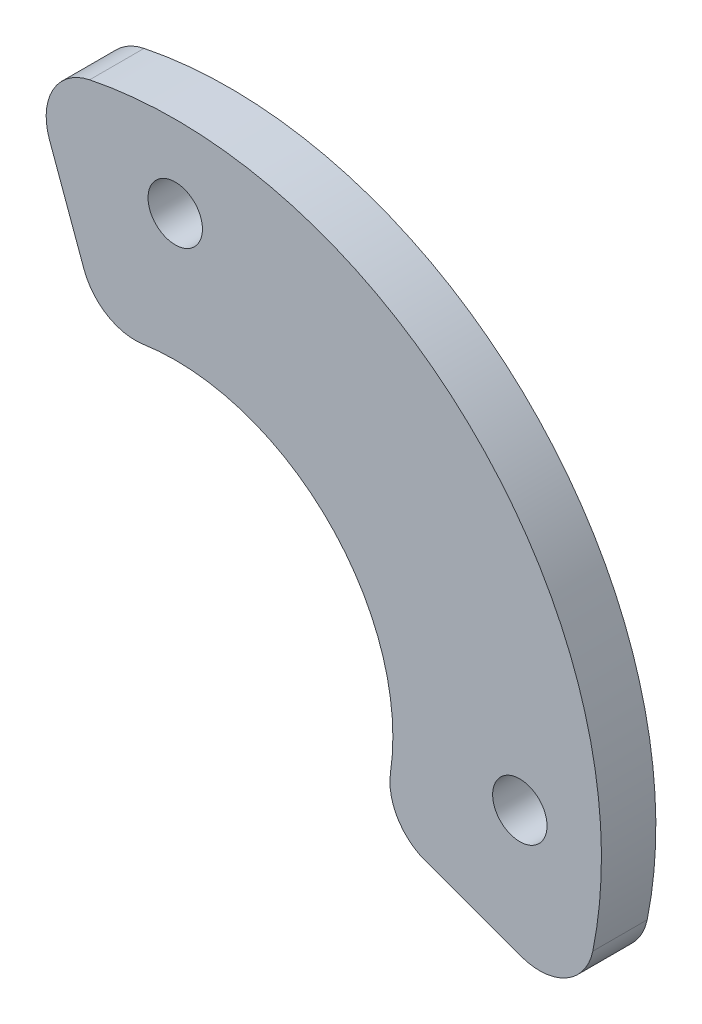
ISO-10303-21;
HEADER;
FILE_DESCRIPTION(('STEP AP214'),'2;1');
FILE_NAME('part.step','',(''),(''),'','','');
FILE_SCHEMA(('AUTOMOTIVE_DESIGN { 1 0 10303 214 1 1 1 1 }'));
ENDSEC;
DATA;
#1=APPLICATION_CONTEXT('core data for automotive mechanical design processes');
#2=APPLICATION_PROTOCOL_DEFINITION('international standard','automotive_design',2000,#1);
#3=PRODUCT_CONTEXT('',#1,'mechanical');
#4=PRODUCT('Part','Part','',(#3));
#5=PRODUCT_RELATED_PRODUCT_CATEGORY('part','',(#4));
#6=PRODUCT_DEFINITION_FORMATION('','',#4);
#7=PRODUCT_DEFINITION_CONTEXT('part definition',#1,'design');
#8=PRODUCT_DEFINITION('design','',#6,#7);
#9=PRODUCT_DEFINITION_SHAPE('','',#8);
#10=(LENGTH_UNIT() NAMED_UNIT(*) SI_UNIT(.MILLI.,.METRE.));
#11=(NAMED_UNIT(*) PLANE_ANGLE_UNIT() SI_UNIT($,.RADIAN.));
#12=(NAMED_UNIT(*) SI_UNIT($,.STERADIAN.) SOLID_ANGLE_UNIT());
#13=UNCERTAINTY_MEASURE_WITH_UNIT(LENGTH_MEASURE(1.E-05),#10,'distance_accuracy_value','');
#14=(GEOMETRIC_REPRESENTATION_CONTEXT(3) GLOBAL_UNCERTAINTY_ASSIGNED_CONTEXT((#13)) GLOBAL_UNIT_ASSIGNED_CONTEXT((#10,
#11,#12)) REPRESENTATION_CONTEXT('',''));
#15=CARTESIAN_POINT('',(0.,0.,0.));
#16=DIRECTION('',(0.,0.,1.));
#17=DIRECTION('',(1.,0.,0.));
#18=AXIS2_PLACEMENT_3D('',#15,#16,#17);
#19=CARTESIAN_POINT('',(0.,0.,3.));
#20=DIRECTION('',(0.342020143325663,0.939692620785911,0.));
#21=DIRECTION('',(-0.939692620785911,0.342020143325663,0.));
#22=AXIS2_PLACEMENT_3D('',#19,#20,#21);
#23=PLANE('',#22);
#24=DIRECTION('',(0.939692620785911,-0.342020143325663,0.));
#25=VECTOR('',#24,1.);
#26=CARTESIAN_POINT('',(0.,0.,0.));
#27=LINE('',#26,#25);
#28=CARTESIAN_POINT('',(13.8106046159048,-5.02664899740866,0.));
#29=VERTEX_POINT('',#28);
#30=CARTESIAN_POINT('',(19.0563083680009,-6.93592902095015,0.));
#31=VERTEX_POINT('',#30);
#32=EDGE_CURVE('E138',#29,#31,#27,.T.);
#33=ORIENTED_EDGE('',*,*,#32,.T.);
#34=DIRECTION('',(0.,0.,-1.));
#35=VECTOR('',#34,1.);
#36=CARTESIAN_POINT('',(19.0563083680009,-6.93592902095015,3.));
#37=LINE('',#36,#35);
#38=CARTESIAN_POINT('',(19.0563083680009,-6.93592902095015,3.));
#39=VERTEX_POINT('',#38);
#40=EDGE_CURVE('E115',#31,#39,#37,.F.);
#41=ORIENTED_EDGE('',*,*,#40,.T.);
#42=DIRECTION('',(0.939692620785911,-0.342020143325663,0.));
#43=VECTOR('',#42,1.);
#44=CARTESIAN_POINT('',(0.,0.,3.));
#45=LINE('',#44,#43);
#46=CARTESIAN_POINT('',(13.8106046159048,-5.02664899740866,3.));
#47=VERTEX_POINT('',#46);
#48=EDGE_CURVE('E187',#47,#39,#45,.T.);
#49=ORIENTED_EDGE('',*,*,#48,.F.);
#50=DIRECTION('',(0.,0.,1.));
#51=VECTOR('',#50,1.);
#52=CARTESIAN_POINT('',(13.8106046159048,-5.02664899740866,0.));
#53=LINE('',#52,#51);
#54=EDGE_CURVE('E120',#47,#29,#53,.F.);
#55=ORIENTED_EDGE('',*,*,#54,.T.);
#56=EDGE_LOOP('',(#33,#41,#49,#55));
#57=FACE_BOUND('',#56,.T.);
#58=ADVANCED_FACE('F43',(#57),#23,.F.);
#59=CARTESIAN_POINT('',(0.,0.,3.));
#60=DIRECTION('',(0.,0.,-1.));
#61=DIRECTION('',(-1.,0.,0.));
#62=AXIS2_PLACEMENT_3D('',#59,#60,#61);
#63=CYLINDRICAL_SURFACE('',#62,23.5);
#64=CARTESIAN_POINT('',(0.,0.,3.));
#65=DIRECTION('',(0.,0.,1.));
#66=DIRECTION('',(1.,0.,0.));
#67=AXIS2_PLACEMENT_3D('',#64,#65,#66);
#68=CIRCLE('',#67,23.5);
#69=CARTESIAN_POINT('',(23.0212520367064,-4.71931718180106,3.));
#70=VERTEX_POINT('',#69);
#71=CARTESIAN_POINT('',(-4.71931718180107,23.0212520367064,3.));
#72=VERTEX_POINT('',#71);
#73=EDGE_CURVE('E130',#70,#72,#68,.T.);
#74=ORIENTED_EDGE('',*,*,#73,.F.);
#75=DIRECTION('',(0.,0.,-1.));
#76=VECTOR('',#75,1.);
#77=CARTESIAN_POINT('',(23.0212520367064,-4.71931718180107,3.));
#78=LINE('',#77,#76);
#79=CARTESIAN_POINT('',(23.0212520367064,-4.71931718180106,0.));
#80=VERTEX_POINT('',#79);
#81=EDGE_CURVE('E114',#70,#80,#78,.T.);
#82=ORIENTED_EDGE('',*,*,#81,.T.);
#83=CARTESIAN_POINT('',(0.,0.,0.));
#84=DIRECTION('',(0.,0.,1.));
#85=DIRECTION('',(1.,0.,0.));
#86=AXIS2_PLACEMENT_3D('',#83,#84,#85);
#87=CIRCLE('',#86,23.5);
#88=CARTESIAN_POINT('',(-4.71931718180107,23.0212520367064,0.));
#89=VERTEX_POINT('',#88);
#90=EDGE_CURVE('E127',#80,#89,#87,.T.);
#91=ORIENTED_EDGE('',*,*,#90,.T.);
#92=DIRECTION('',(0.,0.,-1.));
#93=VECTOR('',#92,1.);
#94=CARTESIAN_POINT('',(-4.71931718180107,23.0212520367064,3.));
#95=LINE('',#94,#93);
#96=EDGE_CURVE('E132',#89,#72,#95,.F.);
#97=ORIENTED_EDGE('',*,*,#96,.T.);
#98=EDGE_LOOP('',(#74,#82,#91,#97));
#99=FACE_BOUND('',#98,.T.);
#100=ADVANCED_FACE('F126',(#99),#63,.T.);
#101=CARTESIAN_POINT('',(0.,0.,3.));
#102=DIRECTION('',(-0.93969262078591,-0.342020143325663,0.));
#103=DIRECTION('',(0.342020143325663,-0.93969262078591,0.));
#104=AXIS2_PLACEMENT_3D('',#101,#102,#103);
#105=PLANE('',#104);
#106=DIRECTION('',(-0.342020143325663,0.939692620785911,0.));
#107=VECTOR('',#106,1.);
#108=CARTESIAN_POINT('',(0.,0.,3.));
#109=LINE('',#108,#107);
#110=CARTESIAN_POINT('',(-5.02664899740867,13.8106046159048,3.));
#111=VERTEX_POINT('',#110);
#112=CARTESIAN_POINT('',(-6.93592902095016,19.0563083680009,3.));
#113=VERTEX_POINT('',#112);
#114=EDGE_CURVE('E172',#111,#113,#109,.T.);
#115=ORIENTED_EDGE('',*,*,#114,.T.);
#116=DIRECTION('',(0.,0.,1.));
#117=VECTOR('',#116,1.);
#118=CARTESIAN_POINT('',(-6.93592902095016,19.0563083680009,0.));
#119=LINE('',#118,#117);
#120=CARTESIAN_POINT('',(-6.93592902095016,19.0563083680009,0.));
#121=VERTEX_POINT('',#120);
#122=EDGE_CURVE('E11',#113,#121,#119,.F.);
#123=ORIENTED_EDGE('',*,*,#122,.T.);
#124=DIRECTION('',(-0.342020143325663,0.939692620785911,0.));
#125=VECTOR('',#124,1.);
#126=CARTESIAN_POINT('',(0.,0.,0.));
#127=LINE('',#126,#125);
#128=CARTESIAN_POINT('',(-5.02664899740867,13.8106046159048,0.));
#129=VERTEX_POINT('',#128);
#130=EDGE_CURVE('E137',#129,#121,#127,.T.);
#131=ORIENTED_EDGE('',*,*,#130,.F.);
#132=DIRECTION('',(0.,0.,-1.));
#133=VECTOR('',#132,1.);
#134=CARTESIAN_POINT('',(-5.02664899740867,13.8106046159048,3.));
#135=LINE('',#134,#133);
#136=EDGE_CURVE('E51',#129,#111,#135,.F.);
#137=ORIENTED_EDGE('',*,*,#136,.T.);
#138=EDGE_LOOP('',(#115,#123,#131,#137));
#139=FACE_BOUND('',#138,.T.);
#140=ADVANCED_FACE('F171',(#139),#105,.T.);
#141=CARTESIAN_POINT('',(19.,0.,3.));
#142=DIRECTION('',(0.,0.,-1.));
#143=DIRECTION('',(-1.,0.,0.));
#144=AXIS2_PLACEMENT_3D('',#141,#142,#143);
#145=CYLINDRICAL_SURFACE('',#144,1.5);
#146=CARTESIAN_POINT('',(19.,0.,3.));
#147=DIRECTION('',(0.,0.,1.));
#148=DIRECTION('',(1.,0.,0.));
#149=AXIS2_PLACEMENT_3D('',#146,#147,#148);
#150=CIRCLE('',#149,1.5);
#151=CARTESIAN_POINT('',(20.5,0.,3.));
#152=VERTEX_POINT('',#151);
#153=EDGE_CURVE('E188',#152,#152,#150,.T.);
#154=ORIENTED_EDGE('',*,*,#153,.T.);
#155=EDGE_LOOP('',(#154));
#156=FACE_BOUND('',#155,.T.);
#157=CARTESIAN_POINT('',(19.,0.,0.));
#158=DIRECTION('',(0.,0.,1.));
#159=DIRECTION('',(1.,0.,0.));
#160=AXIS2_PLACEMENT_3D('',#157,#158,#159);
#161=CIRCLE('',#160,1.5);
#162=CARTESIAN_POINT('',(20.5,0.,0.));
#163=VERTEX_POINT('',#162);
#164=EDGE_CURVE('E142',#163,#163,#161,.T.);
#165=ORIENTED_EDGE('',*,*,#164,.F.);
#166=EDGE_LOOP('',(#165));
#167=FACE_BOUND('',#166,.T.);
#168=ADVANCED_FACE('F202',(#156,#167),#145,.F.);
#169=CARTESIAN_POINT('',(0.,19.,3.));
#170=DIRECTION('',(0.,0.,-1.));
#171=DIRECTION('',(-1.,0.,0.));
#172=AXIS2_PLACEMENT_3D('',#169,#170,#171);
#173=CYLINDRICAL_SURFACE('',#172,1.5);
#174=CARTESIAN_POINT('',(0.,19.,3.));
#175=DIRECTION('',(0.,0.,1.));
#176=DIRECTION('',(1.,0.,0.));
#177=AXIS2_PLACEMENT_3D('',#174,#175,#176);
#178=CIRCLE('',#177,1.5);
#179=CARTESIAN_POINT('',(1.5,19.,3.));
#180=VERTEX_POINT('',#179);
#181=EDGE_CURVE('E148',#180,#180,#178,.T.);
#182=ORIENTED_EDGE('',*,*,#181,.T.);
#183=EDGE_LOOP('',(#182));
#184=FACE_BOUND('',#183,.T.);
#185=CARTESIAN_POINT('',(0.,19.,0.));
#186=DIRECTION('',(0.,0.,1.));
#187=DIRECTION('',(1.,0.,0.));
#188=AXIS2_PLACEMENT_3D('',#185,#186,#187);
#189=CIRCLE('',#188,1.5);
#190=CARTESIAN_POINT('',(1.5,19.,0.));
#191=VERTEX_POINT('',#190);
#192=EDGE_CURVE('E196',#191,#191,#189,.T.);
#193=ORIENTED_EDGE('',*,*,#192,.F.);
#194=EDGE_LOOP('',(#193));
#195=FACE_BOUND('',#194,.T.);
#196=ADVANCED_FACE('F204',(#184,#195),#173,.F.);
#197=CARTESIAN_POINT('',(0.,0.,3.));
#198=DIRECTION('',(0.,0.,-1.));
#199=DIRECTION('',(-1.,0.,0.));
#200=AXIS2_PLACEMENT_3D('',#197,#198,#199);
#201=CYLINDRICAL_SURFACE('',#200,12.);
#202=CARTESIAN_POINT('',(0.,0.,0.));
#203=DIRECTION('',(0.,0.,1.));
#204=DIRECTION('',(1.,0.,0.));
#205=AXIS2_PLACEMENT_3D('',#202,#203,#204);
#206=CIRCLE('',#205,12.);
#207=CARTESIAN_POINT('',(11.8693320367054,-1.76605690804074,0.));
#208=VERTEX_POINT('',#207);
#209=CARTESIAN_POINT('',(-1.76605690804075,11.8693320367054,0.));
#210=VERTEX_POINT('',#209);
#211=EDGE_CURVE('E140',#208,#210,#206,.T.);
#212=ORIENTED_EDGE('',*,*,#211,.F.);
#213=DIRECTION('',(0.,0.,-1.));
#214=VECTOR('',#213,1.);
#215=CARTESIAN_POINT('',(11.8693320367054,-1.76605690804074,3.));
#216=LINE('',#215,#214);
#217=CARTESIAN_POINT('',(11.8693320367054,-1.76605690804074,3.));
#218=VERTEX_POINT('',#217);
#219=EDGE_CURVE('E65',#208,#218,#216,.F.);
#220=ORIENTED_EDGE('',*,*,#219,.T.);
#221=CARTESIAN_POINT('',(0.,0.,3.));
#222=DIRECTION('',(0.,0.,1.));
#223=DIRECTION('',(1.,0.,0.));
#224=AXIS2_PLACEMENT_3D('',#221,#222,#223);
#225=CIRCLE('',#224,12.);
#226=CARTESIAN_POINT('',(-1.76605690804075,11.8693320367054,3.));
#227=VERTEX_POINT('',#226);
#228=EDGE_CURVE('E149',#218,#227,#225,.T.);
#229=ORIENTED_EDGE('',*,*,#228,.T.);
#230=DIRECTION('',(0.,0.,-1.));
#231=VECTOR('',#230,1.);
#232=CARTESIAN_POINT('',(-1.76605690804075,11.8693320367054,3.));
#233=LINE('',#232,#231);
#234=EDGE_CURVE('E164',#227,#210,#233,.T.);
#235=ORIENTED_EDGE('',*,*,#234,.T.);
#236=EDGE_LOOP('',(#212,#220,#229,#235));
#237=FACE_BOUND('',#236,.T.);
#238=ADVANCED_FACE('F180',(#237),#201,.F.);
#239=CARTESIAN_POINT('',(0.,0.,3.));
#240=DIRECTION('',(0.,0.,1.));
#241=DIRECTION('',(1.,0.,0.));
#242=AXIS2_PLACEMENT_3D('',#239,#240,#241);
#243=PLANE('',#242);
#244=ORIENTED_EDGE('',*,*,#181,.F.);
#245=EDGE_LOOP('',(#244));
#246=FACE_BOUND('',#245,.T.);
#247=ORIENTED_EDGE('',*,*,#153,.F.);
#248=EDGE_LOOP('',(#247));
#249=FACE_BOUND('',#248,.T.);
#250=ORIENTED_EDGE('',*,*,#48,.T.);
#251=CARTESIAN_POINT('',(20.0823687979779,-4.11685115859242,3.));
#252=DIRECTION('',(0.,0.,1.));
#253=DIRECTION('',(1.,0.,0.));
#254=AXIS2_PLACEMENT_3D('',#251,#252,#253);
#255=CIRCLE('',#254,3.);
#256=EDGE_CURVE('E162',#39,#70,#255,.T.);
#257=ORIENTED_EDGE('',*,*,#256,.T.);
#258=ORIENTED_EDGE('',*,*,#73,.T.);
#259=CARTESIAN_POINT('',(-4.11685115859243,20.0823687979779,3.));
#260=DIRECTION('',(0.,0.,1.));
#261=DIRECTION('',(1.,0.,0.));
#262=AXIS2_PLACEMENT_3D('',#259,#260,#261);
#263=CIRCLE('',#262,3.);
#264=EDGE_CURVE('E158',#72,#113,#263,.T.);
#265=ORIENTED_EDGE('',*,*,#264,.T.);
#266=ORIENTED_EDGE('',*,*,#114,.F.);
#267=CARTESIAN_POINT('',(-2.20757113505094,14.8366650458818,3.));
#268=DIRECTION('',(0.,0.,1.));
#269=DIRECTION('',(1.,0.,0.));
#270=AXIS2_PLACEMENT_3D('',#267,#268,#269);
#271=CIRCLE('',#270,3.);
#272=EDGE_CURVE('E58',#111,#227,#271,.T.);
#273=ORIENTED_EDGE('',*,*,#272,.T.);
#274=ORIENTED_EDGE('',*,*,#228,.F.);
#275=CARTESIAN_POINT('',(14.8366650458818,-2.20757113505093,3.));
#276=DIRECTION('',(0.,0.,1.));
#277=DIRECTION('',(1.,0.,0.));
#278=AXIS2_PLACEMENT_3D('',#275,#276,#277);
#279=CIRCLE('',#278,3.);
#280=EDGE_CURVE('E160',#218,#47,#279,.T.);
#281=ORIENTED_EDGE('',*,*,#280,.T.);
#282=EDGE_LOOP('',(#250,#257,#258,#265,#266,#273,#274,#281));
#283=FACE_BOUND('',#282,.T.);
#284=ADVANCED_FACE('F176',(#246,#249,#283),#243,.T.);
#285=CARTESIAN_POINT('',(0.,0.,0.));
#286=DIRECTION('',(0.,0.,1.));
#287=DIRECTION('',(1.,0.,0.));
#288=AXIS2_PLACEMENT_3D('',#285,#286,#287);
#289=PLANE('',#288);
#290=ORIENTED_EDGE('',*,*,#192,.T.);
#291=EDGE_LOOP('',(#290));
#292=FACE_BOUND('',#291,.T.);
#293=ORIENTED_EDGE('',*,*,#164,.T.);
#294=EDGE_LOOP('',(#293));
#295=FACE_BOUND('',#294,.T.);
#296=ORIENTED_EDGE('',*,*,#90,.F.);
#297=CARTESIAN_POINT('',(20.0823687979779,-4.11685115859242,0.));
#298=DIRECTION('',(0.,0.,1.));
#299=DIRECTION('',(1.,0.,0.));
#300=AXIS2_PLACEMENT_3D('',#297,#298,#299);
#301=CIRCLE('',#300,3.);
#302=EDGE_CURVE('E110',#80,#31,#301,.F.);
#303=ORIENTED_EDGE('',*,*,#302,.T.);
#304=ORIENTED_EDGE('',*,*,#32,.F.);
#305=CARTESIAN_POINT('',(14.8366650458818,-2.20757113505093,0.));
#306=DIRECTION('',(0.,0.,1.));
#307=DIRECTION('',(1.,0.,0.));
#308=AXIS2_PLACEMENT_3D('',#305,#306,#307);
#309=CIRCLE('',#308,3.);
#310=EDGE_CURVE('E121',#29,#208,#309,.F.);
#311=ORIENTED_EDGE('',*,*,#310,.T.);
#312=ORIENTED_EDGE('',*,*,#211,.T.);
#313=CARTESIAN_POINT('',(-2.20757113505094,14.8366650458818,0.));
#314=DIRECTION('',(0.,0.,1.));
#315=DIRECTION('',(1.,0.,0.));
#316=AXIS2_PLACEMENT_3D('',#313,#314,#315);
#317=CIRCLE('',#316,3.);
#318=EDGE_CURVE('E131',#210,#129,#317,.F.);
#319=ORIENTED_EDGE('',*,*,#318,.T.);
#320=ORIENTED_EDGE('',*,*,#130,.T.);
#321=CARTESIAN_POINT('',(-4.11685115859243,20.0823687979779,0.));
#322=DIRECTION('',(0.,0.,1.));
#323=DIRECTION('',(1.,0.,0.));
#324=AXIS2_PLACEMENT_3D('',#321,#322,#323);
#325=CIRCLE('',#324,3.);
#326=EDGE_CURVE('E136',#121,#89,#325,.F.);
#327=ORIENTED_EDGE('',*,*,#326,.T.);
#328=EDGE_LOOP('',(#296,#303,#304,#311,#312,#319,#320,#327));
#329=FACE_BOUND('',#328,.T.);
#330=ADVANCED_FACE('F134',(#292,#295,#329),#289,.F.);
#331=CARTESIAN_POINT('',(20.0823687979779,-4.11685115859242,3.));
#332=DIRECTION('',(0.,0.,-1.));
#333=DIRECTION('',(-1.,0.,0.));
#334=AXIS2_PLACEMENT_3D('',#331,#332,#333);
#335=CYLINDRICAL_SURFACE('',#334,3.);
#336=ORIENTED_EDGE('',*,*,#256,.F.);
#337=ORIENTED_EDGE('',*,*,#40,.F.);
#338=ORIENTED_EDGE('',*,*,#302,.F.);
#339=ORIENTED_EDGE('',*,*,#81,.F.);
#340=EDGE_LOOP('',(#336,#337,#338,#339));
#341=FACE_BOUND('',#340,.T.);
#342=ADVANCED_FACE('F113',(#341),#335,.T.);
#343=CARTESIAN_POINT('',(14.8366650458818,-2.20757113505093,3.));
#344=DIRECTION('',(0.,0.,-1.));
#345=DIRECTION('',(-1.,0.,0.));
#346=AXIS2_PLACEMENT_3D('',#343,#344,#345);
#347=CYLINDRICAL_SURFACE('',#346,3.);
#348=ORIENTED_EDGE('',*,*,#280,.F.);
#349=ORIENTED_EDGE('',*,*,#219,.F.);
#350=ORIENTED_EDGE('',*,*,#310,.F.);
#351=ORIENTED_EDGE('',*,*,#54,.F.);
#352=EDGE_LOOP('',(#348,#349,#350,#351));
#353=FACE_BOUND('',#352,.T.);
#354=ADVANCED_FACE('F184',(#353),#347,.T.);
#355=CARTESIAN_POINT('',(-4.11685115859243,20.0823687979779,3.));
#356=DIRECTION('',(0.,0.,-1.));
#357=DIRECTION('',(-1.,0.,0.));
#358=AXIS2_PLACEMENT_3D('',#355,#356,#357);
#359=CYLINDRICAL_SURFACE('',#358,3.);
#360=ORIENTED_EDGE('',*,*,#264,.F.);
#361=ORIENTED_EDGE('',*,*,#96,.F.);
#362=ORIENTED_EDGE('',*,*,#326,.F.);
#363=ORIENTED_EDGE('',*,*,#122,.F.);
#364=EDGE_LOOP('',(#360,#361,#362,#363));
#365=FACE_BOUND('',#364,.T.);
#366=ADVANCED_FACE('F254',(#365),#359,.T.);
#367=CARTESIAN_POINT('',(-2.20757113505094,14.8366650458818,3.));
#368=DIRECTION('',(0.,0.,-1.));
#369=DIRECTION('',(-1.,0.,0.));
#370=AXIS2_PLACEMENT_3D('',#367,#368,#369);
#371=CYLINDRICAL_SURFACE('',#370,3.);
#372=ORIENTED_EDGE('',*,*,#272,.F.);
#373=ORIENTED_EDGE('',*,*,#136,.F.);
#374=ORIENTED_EDGE('',*,*,#318,.F.);
#375=ORIENTED_EDGE('',*,*,#234,.F.);
#376=EDGE_LOOP('',(#372,#373,#374,#375));
#377=FACE_BOUND('',#376,.T.);
#378=ADVANCED_FACE('F45',(#377),#371,.T.);
#379=CLOSED_SHELL('',(#58,#100,#140,#168,#196,#238,#284,#330,#342,#354,#366,#378));
#380=MANIFOLD_SOLID_BREP('B2',#379);
#381=ADVANCED_BREP_SHAPE_REPRESENTATION('',(#18,#380),#14);
#382=SHAPE_DEFINITION_REPRESENTATION(#9,#381);
ENDSEC;
END-ISO-10303-21;
